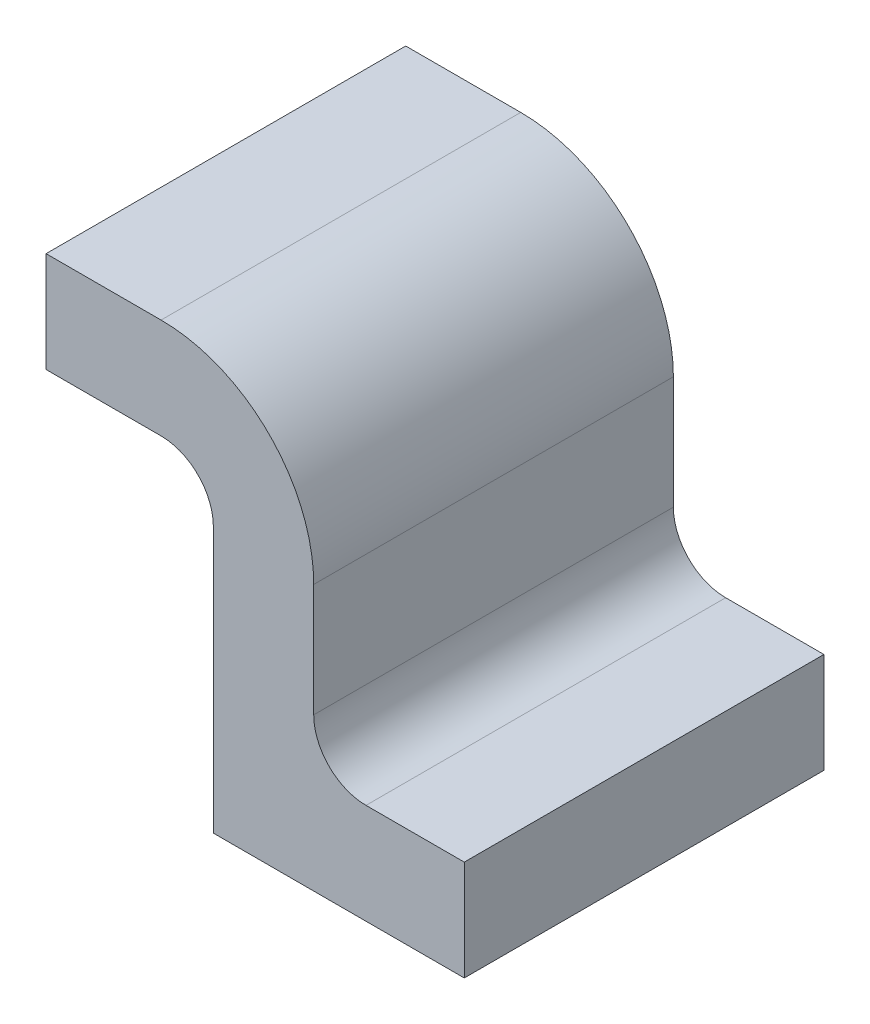
ISO-10303-21;
HEADER;
FILE_DESCRIPTION(('STEP AP214'),'2;1');
FILE_NAME('part.step','',(''),(''),'','','');
FILE_SCHEMA(('AUTOMOTIVE_DESIGN { 1 0 10303 214 1 1 1 1 }'));
ENDSEC;
DATA;
#1=APPLICATION_CONTEXT('core data for automotive mechanical design processes');
#2=APPLICATION_PROTOCOL_DEFINITION('international standard','automotive_design',2000,#1);
#3=PRODUCT_CONTEXT('',#1,'mechanical');
#4=PRODUCT('Part','Part','',(#3));
#5=PRODUCT_RELATED_PRODUCT_CATEGORY('part','',(#4));
#6=PRODUCT_DEFINITION_FORMATION('','',#4);
#7=PRODUCT_DEFINITION_CONTEXT('part definition',#1,'design');
#8=PRODUCT_DEFINITION('design','',#6,#7);
#9=PRODUCT_DEFINITION_SHAPE('','',#8);
#10=(LENGTH_UNIT() NAMED_UNIT(*) SI_UNIT(.MILLI.,.METRE.));
#11=(NAMED_UNIT(*) PLANE_ANGLE_UNIT() SI_UNIT($,.RADIAN.));
#12=(NAMED_UNIT(*) SI_UNIT($,.STERADIAN.) SOLID_ANGLE_UNIT());
#13=UNCERTAINTY_MEASURE_WITH_UNIT(LENGTH_MEASURE(1.E-05),#10,'distance_accuracy_value','');
#14=(GEOMETRIC_REPRESENTATION_CONTEXT(3) GLOBAL_UNCERTAINTY_ASSIGNED_CONTEXT((#13)) GLOBAL_UNIT_ASSIGNED_CONTEXT((#10,
#11,#12)) REPRESENTATION_CONTEXT('',''));
#15=CARTESIAN_POINT('',(0.,0.,0.));
#16=DIRECTION('',(0.,0.,1.));
#17=DIRECTION('',(1.,0.,0.));
#18=AXIS2_PLACEMENT_3D('',#15,#16,#17);
#19=CARTESIAN_POINT('',(0.5,-0.5,0.));
#20=DIRECTION('',(1.,0.,0.));
#21=DIRECTION('',(0.,0.,-1.));
#22=AXIS2_PLACEMENT_3D('',#19,#20,#21);
#23=PLANE('',#22);
#24=DIRECTION('',(0.,0.,-1.));
#25=VECTOR('',#24,1.);
#26=CARTESIAN_POINT('',(0.5,-0.5,0.));
#27=LINE('',#26,#25);
#28=CARTESIAN_POINT('',(0.5,-0.5,0.));
#29=VERTEX_POINT('',#28);
#30=CARTESIAN_POINT('',(0.5,-0.5,0.43));
#31=VERTEX_POINT('',#30);
#32=EDGE_CURVE('E117',#29,#31,#27,.F.);
#33=ORIENTED_EDGE('',*,*,#32,.F.);
#34=DIRECTION('',(0.,1.,0.));
#35=VECTOR('',#34,1.);
#36=CARTESIAN_POINT('',(0.5,0.,0.));
#37=LINE('',#36,#35);
#38=CARTESIAN_POINT('',(0.5,-0.38,0.));
#39=VERTEX_POINT('',#38);
#40=EDGE_CURVE('E78',#29,#39,#37,.T.);
#41=ORIENTED_EDGE('',*,*,#40,.T.);
#42=DIRECTION('',(0.,0.,1.));
#43=VECTOR('',#42,1.);
#44=CARTESIAN_POINT('',(0.5,-0.38,0.));
#45=LINE('',#44,#43);
#46=CARTESIAN_POINT('',(0.5,-0.38,0.43));
#47=VERTEX_POINT('',#46);
#48=EDGE_CURVE('E195',#47,#39,#45,.F.);
#49=ORIENTED_EDGE('',*,*,#48,.F.);
#50=DIRECTION('',(0.,1.,0.));
#51=VECTOR('',#50,1.);
#52=CARTESIAN_POINT('',(0.5,0.,0.43));
#53=LINE('',#52,#51);
#54=EDGE_CURVE('E130',#31,#47,#53,.T.);
#55=ORIENTED_EDGE('',*,*,#54,.F.);
#56=EDGE_LOOP('',(#33,#41,#49,#55));
#57=FACE_BOUND('',#56,.T.);
#58=ADVANCED_FACE('F16',(#57),#23,.T.);
#59=CARTESIAN_POINT('',(0.5,-0.38,0.));
#60=DIRECTION('',(0.,1.,0.));
#61=DIRECTION('',(0.,0.,1.));
#62=AXIS2_PLACEMENT_3D('',#59,#60,#61);
#63=PLANE('',#62);
#64=DIRECTION('',(1.,0.,0.));
#65=VECTOR('',#64,1.);
#66=CARTESIAN_POINT('',(0.,-0.38,0.));
#67=LINE('',#66,#65);
#68=CARTESIAN_POINT('',(0.3825,-0.38,0.));
#69=VERTEX_POINT('',#68);
#70=EDGE_CURVE('E69',#39,#69,#67,.F.);
#71=ORIENTED_EDGE('',*,*,#70,.T.);
#72=DIRECTION('',(0.,0.,1.));
#73=VECTOR('',#72,1.);
#74=CARTESIAN_POINT('',(0.3825,-0.38,-0.560548));
#75=LINE('',#74,#73);
#76=CARTESIAN_POINT('',(0.3825,-0.38,0.43));
#77=VERTEX_POINT('',#76);
#78=EDGE_CURVE('E193',#69,#77,#75,.T.);
#79=ORIENTED_EDGE('',*,*,#78,.T.);
#80=DIRECTION('',(1.,0.,0.));
#81=VECTOR('',#80,1.);
#82=CARTESIAN_POINT('',(0.,-0.38,0.43));
#83=LINE('',#82,#81);
#84=EDGE_CURVE('E168',#47,#77,#83,.F.);
#85=ORIENTED_EDGE('',*,*,#84,.F.);
#86=ORIENTED_EDGE('',*,*,#48,.T.);
#87=EDGE_LOOP('',(#71,#79,#85,#86));
#88=FACE_BOUND('',#87,.T.);
#89=ADVANCED_FACE('F246',(#88),#63,.T.);
#90=CARTESIAN_POINT('',(0.3825,-0.3175,-0.560548));
#91=DIRECTION('',(0.,0.,1.));
#92=DIRECTION('',(1.,0.,0.));
#93=AXIS2_PLACEMENT_3D('',#90,#91,#92);
#94=CYLINDRICAL_SURFACE('',#93,0.0625);
#95=DIRECTION('',(0.,0.,-1.));
#96=VECTOR('',#95,1.);
#97=CARTESIAN_POINT('',(0.32,-0.3175,0.));
#98=LINE('',#97,#96);
#99=CARTESIAN_POINT('',(0.32,-0.3175,0.43));
#100=VERTEX_POINT('',#99);
#101=CARTESIAN_POINT('',(0.32,-0.3175,0.));
#102=VERTEX_POINT('',#101);
#103=EDGE_CURVE('E190',#100,#102,#98,.T.);
#104=ORIENTED_EDGE('',*,*,#103,.F.);
#105=CARTESIAN_POINT('',(0.3825,-0.3175,0.43));
#106=DIRECTION('',(0.,0.,1.));
#107=DIRECTION('',(1.,0.,0.));
#108=AXIS2_PLACEMENT_3D('',#105,#106,#107);
#109=CIRCLE('',#108,0.0625);
#110=EDGE_CURVE('E210',#77,#100,#109,.F.);
#111=ORIENTED_EDGE('',*,*,#110,.F.);
#112=ORIENTED_EDGE('',*,*,#78,.F.);
#113=CARTESIAN_POINT('',(0.3825,-0.3175,0.));
#114=DIRECTION('',(0.,0.,1.));
#115=DIRECTION('',(1.,0.,0.));
#116=AXIS2_PLACEMENT_3D('',#113,#114,#115);
#117=CIRCLE('',#116,0.0625);
#118=EDGE_CURVE('E19',#69,#102,#117,.F.);
#119=ORIENTED_EDGE('',*,*,#118,.T.);
#120=EDGE_LOOP('',(#104,#111,#112,#119));
#121=FACE_BOUND('',#120,.T.);
#122=ADVANCED_FACE('F250',(#121),#94,.F.);
#123=CARTESIAN_POINT('',(0.32,-0.38,0.));
#124=DIRECTION('',(1.,0.,0.));
#125=DIRECTION('',(0.,0.,-1.));
#126=AXIS2_PLACEMENT_3D('',#123,#124,#125);
#127=PLANE('',#126);
#128=DIRECTION('',(0.,1.,0.));
#129=VECTOR('',#128,1.);
#130=CARTESIAN_POINT('',(0.32,0.,0.43));
#131=LINE('',#130,#129);
#132=CARTESIAN_POINT('',(0.32,-0.1825,0.43));
#133=VERTEX_POINT('',#132);
#134=EDGE_CURVE('E209',#100,#133,#131,.T.);
#135=ORIENTED_EDGE('',*,*,#134,.F.);
#136=ORIENTED_EDGE('',*,*,#103,.T.);
#137=DIRECTION('',(0.,1.,0.));
#138=VECTOR('',#137,1.);
#139=CARTESIAN_POINT('',(0.32,0.,0.));
#140=LINE('',#139,#138);
#141=CARTESIAN_POINT('',(0.32,-0.1825,0.));
#142=VERTEX_POINT('',#141);
#143=EDGE_CURVE('E156',#102,#142,#140,.T.);
#144=ORIENTED_EDGE('',*,*,#143,.T.);
#145=DIRECTION('',(0.,0.,-1.));
#146=VECTOR('',#145,1.);
#147=CARTESIAN_POINT('',(0.32,-0.1825,0.990548));
#148=LINE('',#147,#146);
#149=EDGE_CURVE('E187',#133,#142,#148,.T.);
#150=ORIENTED_EDGE('',*,*,#149,.F.);
#151=EDGE_LOOP('',(#135,#136,#144,#150));
#152=FACE_BOUND('',#151,.T.);
#153=ADVANCED_FACE('F253',(#152),#127,.T.);
#154=CARTESIAN_POINT('',(0.1375,-0.1825,0.990548));
#155=DIRECTION('',(0.,0.,-1.));
#156=DIRECTION('',(-1.,0.,0.));
#157=AXIS2_PLACEMENT_3D('',#154,#155,#156);
#158=CYLINDRICAL_SURFACE('',#157,0.1825);
#159=ORIENTED_EDGE('',*,*,#149,.T.);
#160=CARTESIAN_POINT('',(0.1375,-0.1825,0.));
#161=DIRECTION('',(0.,0.,-1.));
#162=DIRECTION('',(-1.,0.,0.));
#163=AXIS2_PLACEMENT_3D('',#160,#161,#162);
#164=CIRCLE('',#163,0.1825);
#165=CARTESIAN_POINT('',(0.1375,0.,0.));
#166=VERTEX_POINT('',#165);
#167=EDGE_CURVE('E153',#142,#166,#164,.F.);
#168=ORIENTED_EDGE('',*,*,#167,.T.);
#169=DIRECTION('',(0.,0.,1.));
#170=VECTOR('',#169,1.);
#171=CARTESIAN_POINT('',(0.1375,0.,0.));
#172=LINE('',#171,#170);
#173=CARTESIAN_POINT('',(0.1375,0.,0.43));
#174=VERTEX_POINT('',#173);
#175=EDGE_CURVE('E183',#174,#166,#172,.F.);
#176=ORIENTED_EDGE('',*,*,#175,.F.);
#177=CARTESIAN_POINT('',(0.1375,-0.1825,0.43));
#178=DIRECTION('',(0.,0.,-1.));
#179=DIRECTION('',(-1.,0.,0.));
#180=AXIS2_PLACEMENT_3D('',#177,#178,#179);
#181=CIRCLE('',#180,0.1825);
#182=EDGE_CURVE('E206',#133,#174,#181,.F.);
#183=ORIENTED_EDGE('',*,*,#182,.F.);
#184=EDGE_LOOP('',(#159,#168,#176,#183));
#185=FACE_BOUND('',#184,.T.);
#186=ADVANCED_FACE('F214',(#185),#158,.T.);
#187=CARTESIAN_POINT('',(0.32,0.,0.));
#188=DIRECTION('',(0.,1.,0.));
#189=DIRECTION('',(0.,0.,1.));
#190=AXIS2_PLACEMENT_3D('',#187,#188,#189);
#191=PLANE('',#190);
#192=DIRECTION('',(1.,0.,0.));
#193=VECTOR('',#192,1.);
#194=CARTESIAN_POINT('',(0.,0.,0.43));
#195=LINE('',#194,#193);
#196=CARTESIAN_POINT('',(0.,0.,0.43));
#197=VERTEX_POINT('',#196);
#198=EDGE_CURVE('E179',#174,#197,#195,.F.);
#199=ORIENTED_EDGE('',*,*,#198,.F.);
#200=ORIENTED_EDGE('',*,*,#175,.T.);
#201=DIRECTION('',(1.,0.,0.));
#202=VECTOR('',#201,1.);
#203=CARTESIAN_POINT('',(0.,0.,0.));
#204=LINE('',#203,#202);
#205=CARTESIAN_POINT('',(0.,0.,0.));
#206=VERTEX_POINT('',#205);
#207=EDGE_CURVE('E110',#166,#206,#204,.F.);
#208=ORIENTED_EDGE('',*,*,#207,.T.);
#209=DIRECTION('',(0.,0.,1.));
#210=VECTOR('',#209,1.);
#211=CARTESIAN_POINT('',(0.,0.,0.));
#212=LINE('',#211,#210);
#213=EDGE_CURVE('E172',#197,#206,#212,.F.);
#214=ORIENTED_EDGE('',*,*,#213,.F.);
#215=EDGE_LOOP('',(#199,#200,#208,#214));
#216=FACE_BOUND('',#215,.T.);
#217=ADVANCED_FACE('F218',(#216),#191,.T.);
#218=CARTESIAN_POINT('',(0.,0.,0.));
#219=DIRECTION('',(-1.,0.,0.));
#220=DIRECTION('',(0.,0.,1.));
#221=AXIS2_PLACEMENT_3D('',#218,#219,#220);
#222=PLANE('',#221);
#223=ORIENTED_EDGE('',*,*,#213,.T.);
#224=DIRECTION('',(0.,1.,0.));
#225=VECTOR('',#224,1.);
#226=CARTESIAN_POINT('',(0.,0.,0.));
#227=LINE('',#226,#225);
#228=CARTESIAN_POINT('',(0.,-0.12,0.));
#229=VERTEX_POINT('',#228);
#230=EDGE_CURVE('E114',#206,#229,#227,.F.);
#231=ORIENTED_EDGE('',*,*,#230,.T.);
#232=DIRECTION('',(0.,0.,-1.));
#233=VECTOR('',#232,1.);
#234=CARTESIAN_POINT('',(0.,-0.12,0.));
#235=LINE('',#234,#233);
#236=CARTESIAN_POINT('',(0.,-0.12,0.43));
#237=VERTEX_POINT('',#236);
#238=EDGE_CURVE('E100',#237,#229,#235,.T.);
#239=ORIENTED_EDGE('',*,*,#238,.F.);
#240=DIRECTION('',(0.,1.,0.));
#241=VECTOR('',#240,1.);
#242=CARTESIAN_POINT('',(0.,0.,0.43));
#243=LINE('',#242,#241);
#244=EDGE_CURVE('E175',#197,#237,#243,.F.);
#245=ORIENTED_EDGE('',*,*,#244,.F.);
#246=EDGE_LOOP('',(#223,#231,#239,#245));
#247=FACE_BOUND('',#246,.T.);
#248=ADVANCED_FACE('F278',(#247),#222,.T.);
#249=CARTESIAN_POINT('',(0.,-0.12,0.));
#250=DIRECTION('',(0.,-1.,0.));
#251=DIRECTION('',(0.,0.,-1.));
#252=AXIS2_PLACEMENT_3D('',#249,#250,#251);
#253=PLANE('',#252);
#254=DIRECTION('',(1.,0.,0.));
#255=VECTOR('',#254,1.);
#256=CARTESIAN_POINT('',(0.,-0.12,0.));
#257=LINE('',#256,#255);
#258=CARTESIAN_POINT('',(0.1375,-0.12,0.));
#259=VERTEX_POINT('',#258);
#260=EDGE_CURVE('E93',#229,#259,#257,.T.);
#261=ORIENTED_EDGE('',*,*,#260,.T.);
#262=DIRECTION('',(0.,0.,1.));
#263=VECTOR('',#262,1.);
#264=CARTESIAN_POINT('',(0.1375,-0.12,-0.560548));
#265=LINE('',#264,#263);
#266=CARTESIAN_POINT('',(0.1375,-0.12,0.43));
#267=VERTEX_POINT('',#266);
#268=EDGE_CURVE('E161',#259,#267,#265,.T.);
#269=ORIENTED_EDGE('',*,*,#268,.T.);
#270=DIRECTION('',(1.,0.,0.));
#271=VECTOR('',#270,1.);
#272=CARTESIAN_POINT('',(0.,-0.12,0.43));
#273=LINE('',#272,#271);
#274=EDGE_CURVE('E178',#237,#267,#273,.T.);
#275=ORIENTED_EDGE('',*,*,#274,.F.);
#276=ORIENTED_EDGE('',*,*,#238,.T.);
#277=EDGE_LOOP('',(#261,#269,#275,#276));
#278=FACE_BOUND('',#277,.T.);
#279=ADVANCED_FACE('F223',(#278),#253,.T.);
#280=CARTESIAN_POINT('',(0.,0.,0.));
#281=DIRECTION('',(0.,0.,1.));
#282=DIRECTION('',(1.,0.,0.));
#283=AXIS2_PLACEMENT_3D('',#280,#281,#282);
#284=PLANE('',#283);
#285=CARTESIAN_POINT('',(0.1375,-0.1825,0.));
#286=DIRECTION('',(0.,0.,1.));
#287=DIRECTION('',(1.,0.,0.));
#288=AXIS2_PLACEMENT_3D('',#285,#286,#287);
#289=CIRCLE('',#288,0.0625);
#290=CARTESIAN_POINT('',(0.2,-0.1825,0.));
#291=VERTEX_POINT('',#290);
#292=EDGE_CURVE('E141',#291,#259,#289,.T.);
#293=ORIENTED_EDGE('',*,*,#292,.T.);
#294=ORIENTED_EDGE('',*,*,#260,.F.);
#295=ORIENTED_EDGE('',*,*,#230,.F.);
#296=ORIENTED_EDGE('',*,*,#207,.F.);
#297=ORIENTED_EDGE('',*,*,#167,.F.);
#298=ORIENTED_EDGE('',*,*,#143,.F.);
#299=ORIENTED_EDGE('',*,*,#118,.F.);
#300=ORIENTED_EDGE('',*,*,#70,.F.);
#301=ORIENTED_EDGE('',*,*,#40,.F.);
#302=DIRECTION('',(1.,0.,0.));
#303=VECTOR('',#302,1.);
#304=CARTESIAN_POINT('',(0.2,-0.5,0.));
#305=LINE('',#304,#303);
#306=CARTESIAN_POINT('',(0.2,-0.5,0.));
#307=VERTEX_POINT('',#306);
#308=EDGE_CURVE('E123',#307,#29,#305,.T.);
#309=ORIENTED_EDGE('',*,*,#308,.F.);
#310=DIRECTION('',(0.,1.,0.));
#311=VECTOR('',#310,1.);
#312=CARTESIAN_POINT('',(0.2,-0.12,0.));
#313=LINE('',#312,#311);
#314=EDGE_CURVE('E127',#291,#307,#313,.F.);
#315=ORIENTED_EDGE('',*,*,#314,.F.);
#316=EDGE_LOOP('',(#293,#294,#295,#296,#297,#298,#299,#300,#301,#309,#315));
#317=FACE_BOUND('',#316,.T.);
#318=ADVANCED_FACE('F125',(#317),#284,.F.);
#319=CARTESIAN_POINT('',(0.2,-0.5,0.));
#320=DIRECTION('',(0.,-1.,0.));
#321=DIRECTION('',(0.,0.,-1.));
#322=AXIS2_PLACEMENT_3D('',#319,#320,#321);
#323=PLANE('',#322);
#324=DIRECTION('',(0.,0.,1.));
#325=VECTOR('',#324,1.);
#326=CARTESIAN_POINT('',(0.2,-0.5,0.));
#327=LINE('',#326,#325);
#328=CARTESIAN_POINT('',(0.2,-0.5,0.43));
#329=VERTEX_POINT('',#328);
#330=EDGE_CURVE('E133',#307,#329,#327,.T.);
#331=ORIENTED_EDGE('',*,*,#330,.F.);
#332=ORIENTED_EDGE('',*,*,#308,.T.);
#333=ORIENTED_EDGE('',*,*,#32,.T.);
#334=DIRECTION('',(1.,0.,0.));
#335=VECTOR('',#334,1.);
#336=CARTESIAN_POINT('',(0.,-0.5,0.43));
#337=LINE('',#336,#335);
#338=EDGE_CURVE('E136',#329,#31,#337,.T.);
#339=ORIENTED_EDGE('',*,*,#338,.F.);
#340=EDGE_LOOP('',(#331,#332,#333,#339));
#341=FACE_BOUND('',#340,.T.);
#342=ADVANCED_FACE('F134',(#341),#323,.T.);
#343=CARTESIAN_POINT('',(0.,0.,0.43));
#344=DIRECTION('',(0.,0.,1.));
#345=DIRECTION('',(1.,0.,0.));
#346=AXIS2_PLACEMENT_3D('',#343,#344,#345);
#347=PLANE('',#346);
#348=DIRECTION('',(0.,1.,0.));
#349=VECTOR('',#348,1.);
#350=CARTESIAN_POINT('',(0.2,-0.12,0.43));
#351=LINE('',#350,#349);
#352=CARTESIAN_POINT('',(0.2,-0.1825,0.43));
#353=VERTEX_POINT('',#352);
#354=EDGE_CURVE('E25',#329,#353,#351,.T.);
#355=ORIENTED_EDGE('',*,*,#354,.F.);
#356=ORIENTED_EDGE('',*,*,#338,.T.);
#357=ORIENTED_EDGE('',*,*,#54,.T.);
#358=ORIENTED_EDGE('',*,*,#84,.T.);
#359=ORIENTED_EDGE('',*,*,#110,.T.);
#360=ORIENTED_EDGE('',*,*,#134,.T.);
#361=ORIENTED_EDGE('',*,*,#182,.T.);
#362=ORIENTED_EDGE('',*,*,#198,.T.);
#363=ORIENTED_EDGE('',*,*,#244,.T.);
#364=ORIENTED_EDGE('',*,*,#274,.T.);
#365=CARTESIAN_POINT('',(0.1375,-0.1825,0.43));
#366=DIRECTION('',(0.,0.,1.));
#367=DIRECTION('',(1.,0.,0.));
#368=AXIS2_PLACEMENT_3D('',#365,#366,#367);
#369=CIRCLE('',#368,0.0625);
#370=EDGE_CURVE('E34',#267,#353,#369,.F.);
#371=ORIENTED_EDGE('',*,*,#370,.T.);
#372=EDGE_LOOP('',(#355,#356,#357,#358,#359,#360,#361,#362,#363,#364,#371));
#373=FACE_BOUND('',#372,.T.);
#374=ADVANCED_FACE('F224',(#373),#347,.T.);
#375=CARTESIAN_POINT('',(0.1375,-0.1825,-0.560548));
#376=DIRECTION('',(0.,0.,1.));
#377=DIRECTION('',(1.,0.,0.));
#378=AXIS2_PLACEMENT_3D('',#375,#376,#377);
#379=CYLINDRICAL_SURFACE('',#378,0.0625);
#380=DIRECTION('',(0.,0.,1.));
#381=VECTOR('',#380,1.);
#382=CARTESIAN_POINT('',(0.2,-0.1825,0.));
#383=LINE('',#382,#381);
#384=EDGE_CURVE('E11',#353,#291,#383,.F.);
#385=ORIENTED_EDGE('',*,*,#384,.F.);
#386=ORIENTED_EDGE('',*,*,#370,.F.);
#387=ORIENTED_EDGE('',*,*,#268,.F.);
#388=ORIENTED_EDGE('',*,*,#292,.F.);
#389=EDGE_LOOP('',(#385,#386,#387,#388));
#390=FACE_BOUND('',#389,.T.);
#391=ADVANCED_FACE('F222',(#390),#379,.F.);
#392=CARTESIAN_POINT('',(0.2,-0.12,0.));
#393=DIRECTION('',(-1.,0.,0.));
#394=DIRECTION('',(0.,0.,1.));
#395=AXIS2_PLACEMENT_3D('',#392,#393,#394);
#396=PLANE('',#395);
#397=ORIENTED_EDGE('',*,*,#354,.T.);
#398=ORIENTED_EDGE('',*,*,#384,.T.);
#399=ORIENTED_EDGE('',*,*,#314,.T.);
#400=ORIENTED_EDGE('',*,*,#330,.T.);
#401=EDGE_LOOP('',(#397,#398,#399,#400));
#402=FACE_BOUND('',#401,.T.);
#403=ADVANCED_FACE('F140',(#402),#396,.T.);
#404=CLOSED_SHELL('',(#58,#89,#122,#153,#186,#217,#248,#279,#318,#342,#374,#391,#403));
#405=MANIFOLD_SOLID_BREP('B1',#404);
#406=ADVANCED_BREP_SHAPE_REPRESENTATION('',(#18,#405),#14);
#407=SHAPE_DEFINITION_REPRESENTATION(#9,#406);
ENDSEC;
END-ISO-10303-21;
